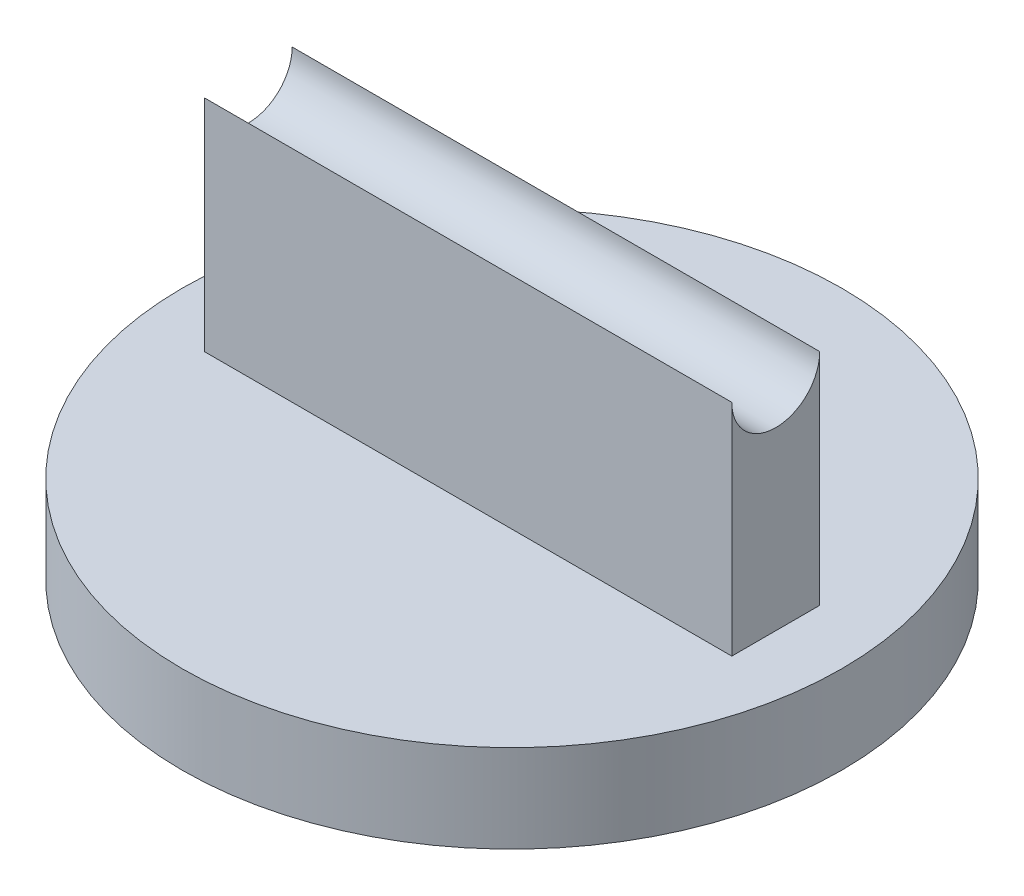
ISO-10303-21;
HEADER;
FILE_DESCRIPTION(('STEP AP214'),'2;1');
FILE_NAME('part.step','',(''),(''),'','','');
FILE_SCHEMA(('AUTOMOTIVE_DESIGN { 1 0 10303 214 1 1 1 1 }'));
ENDSEC;
DATA;
#1=APPLICATION_CONTEXT('core data for automotive mechanical design processes');
#2=APPLICATION_PROTOCOL_DEFINITION('international standard','automotive_design',2000,#1);
#3=PRODUCT_CONTEXT('',#1,'mechanical');
#4=PRODUCT('Part','Part','',(#3));
#5=PRODUCT_RELATED_PRODUCT_CATEGORY('part','',(#4));
#6=PRODUCT_DEFINITION_FORMATION('','',#4);
#7=PRODUCT_DEFINITION_CONTEXT('part definition',#1,'design');
#8=PRODUCT_DEFINITION('design','',#6,#7);
#9=PRODUCT_DEFINITION_SHAPE('','',#8);
#10=(LENGTH_UNIT() NAMED_UNIT(*) SI_UNIT(.MILLI.,.METRE.));
#11=(NAMED_UNIT(*) PLANE_ANGLE_UNIT() SI_UNIT($,.RADIAN.));
#12=(NAMED_UNIT(*) SI_UNIT($,.STERADIAN.) SOLID_ANGLE_UNIT());
#13=UNCERTAINTY_MEASURE_WITH_UNIT(LENGTH_MEASURE(1.E-05),#10,'distance_accuracy_value','');
#14=(GEOMETRIC_REPRESENTATION_CONTEXT(3) GLOBAL_UNCERTAINTY_ASSIGNED_CONTEXT((#13)) GLOBAL_UNIT_ASSIGNED_CONTEXT((#10,
#11,#12)) REPRESENTATION_CONTEXT('',''));
#15=CARTESIAN_POINT('',(0.,0.,0.));
#16=DIRECTION('',(0.,0.,1.));
#17=DIRECTION('',(1.,0.,0.));
#18=AXIS2_PLACEMENT_3D('',#15,#16,#17);
#19=CARTESIAN_POINT('',(0.,20.,0.));
#20=DIRECTION('',(0.,-1.,0.));
#21=DIRECTION('',(0.,0.,-1.));
#22=AXIS2_PLACEMENT_3D('',#19,#20,#21);
#23=CYLINDRICAL_SURFACE('',#22,75.);
#24=CARTESIAN_POINT('',(0.,20.,0.));
#25=DIRECTION('',(0.,1.,0.));
#26=DIRECTION('',(0.,0.,1.));
#27=AXIS2_PLACEMENT_3D('',#24,#25,#26);
#28=CIRCLE('',#27,75.);
#29=CARTESIAN_POINT('',(0.,20.,75.));
#30=VERTEX_POINT('',#29);
#31=EDGE_CURVE('E11',#30,#30,#28,.T.);
#32=ORIENTED_EDGE('',*,*,#31,.F.);
#33=EDGE_LOOP('',(#32));
#34=FACE_BOUND('',#33,.T.);
#35=CARTESIAN_POINT('',(0.,0.,0.));
#36=DIRECTION('',(0.,1.,0.));
#37=DIRECTION('',(0.,0.,1.));
#38=AXIS2_PLACEMENT_3D('',#35,#36,#37);
#39=CIRCLE('',#38,75.);
#40=CARTESIAN_POINT('',(0.,0.,75.));
#41=VERTEX_POINT('',#40);
#42=EDGE_CURVE('E42',#41,#41,#39,.T.);
#43=ORIENTED_EDGE('',*,*,#42,.T.);
#44=EDGE_LOOP('',(#43));
#45=FACE_BOUND('',#44,.T.);
#46=ADVANCED_FACE('F39',(#34,#45),#23,.T.);
#47=CARTESIAN_POINT('',(0.,20.,0.));
#48=DIRECTION('',(0.,1.,0.));
#49=DIRECTION('',(0.,0.,1.));
#50=AXIS2_PLACEMENT_3D('',#47,#48,#49);
#51=PLANE('',#50);
#52=DIRECTION('',(0.,0.,-1.));
#53=VECTOR('',#52,1.);
#54=CARTESIAN_POINT('',(60.,20.,-10.));
#55=LINE('',#54,#53);
#56=CARTESIAN_POINT('',(60.,20.,10.));
#57=VERTEX_POINT('',#56);
#58=CARTESIAN_POINT('',(60.,20.,-10.));
#59=VERTEX_POINT('',#58);
#60=EDGE_CURVE('E54',#57,#59,#55,.T.);
#61=ORIENTED_EDGE('',*,*,#60,.F.);
#62=DIRECTION('',(1.,0.,0.));
#63=VECTOR('',#62,1.);
#64=CARTESIAN_POINT('',(-60.,20.,10.));
#65=LINE('',#64,#63);
#66=CARTESIAN_POINT('',(-60.,20.,10.));
#67=VERTEX_POINT('',#66);
#68=EDGE_CURVE('E58',#67,#57,#65,.T.);
#69=ORIENTED_EDGE('',*,*,#68,.F.);
#70=DIRECTION('',(0.,0.,1.));
#71=VECTOR('',#70,1.);
#72=CARTESIAN_POINT('',(-60.,20.,-10.));
#73=LINE('',#72,#71);
#74=CARTESIAN_POINT('',(-60.,20.,-10.));
#75=VERTEX_POINT('',#74);
#76=EDGE_CURVE('E117',#75,#67,#73,.T.);
#77=ORIENTED_EDGE('',*,*,#76,.F.);
#78=DIRECTION('',(-1.,0.,0.));
#79=VECTOR('',#78,1.);
#80=CARTESIAN_POINT('',(-60.,20.,-10.));
#81=LINE('',#80,#79);
#82=EDGE_CURVE('E102',#59,#75,#81,.T.);
#83=ORIENTED_EDGE('',*,*,#82,.F.);
#84=EDGE_LOOP('',(#61,#69,#77,#83));
#85=FACE_BOUND('',#84,.T.);
#86=ORIENTED_EDGE('',*,*,#31,.T.);
#87=EDGE_LOOP('',(#86));
#88=FACE_BOUND('',#87,.T.);
#89=ADVANCED_FACE('F141',(#85,#88),#51,.T.);
#90=CARTESIAN_POINT('',(0.,0.,0.));
#91=DIRECTION('',(0.,1.,0.));
#92=DIRECTION('',(0.,0.,1.));
#93=AXIS2_PLACEMENT_3D('',#90,#91,#92);
#94=PLANE('',#93);
#95=ORIENTED_EDGE('',*,*,#42,.F.);
#96=EDGE_LOOP('',(#95));
#97=FACE_BOUND('',#96,.T.);
#98=ADVANCED_FACE('F146',(#97),#94,.F.);
#99=CARTESIAN_POINT('',(60.,70.,-10.));
#100=DIRECTION('',(-1.,0.,0.));
#101=DIRECTION('',(0.,0.,1.));
#102=AXIS2_PLACEMENT_3D('',#99,#100,#101);
#103=PLANE('',#102);
#104=DIRECTION('',(0.,-1.,0.));
#105=VECTOR('',#104,1.);
#106=CARTESIAN_POINT('',(60.,70.,-10.));
#107=LINE('',#106,#105);
#108=CARTESIAN_POINT('',(60.,70.,-10.));
#109=VERTEX_POINT('',#108);
#110=EDGE_CURVE('E104',#109,#59,#107,.T.);
#111=ORIENTED_EDGE('',*,*,#110,.F.);
#112=CARTESIAN_POINT('',(60.,70.,0.));
#113=DIRECTION('',(-1.,0.,0.));
#114=DIRECTION('',(0.,0.,1.));
#115=AXIS2_PLACEMENT_3D('',#112,#113,#114);
#116=CIRCLE('',#115,10.);
#117=CARTESIAN_POINT('',(60.,70.,9.99999999999996));
#118=VERTEX_POINT('',#117);
#119=EDGE_CURVE('E83',#109,#118,#116,.T.);
#120=ORIENTED_EDGE('',*,*,#119,.T.);
#121=DIRECTION('',(0.,-1.,0.));
#122=VECTOR('',#121,1.);
#123=CARTESIAN_POINT('',(60.,70.,10.));
#124=LINE('',#123,#122);
#125=EDGE_CURVE('E109',#118,#57,#124,.T.);
#126=ORIENTED_EDGE('',*,*,#125,.T.);
#127=ORIENTED_EDGE('',*,*,#60,.T.);
#128=EDGE_LOOP('',(#111,#120,#126,#127));
#129=FACE_BOUND('',#128,.T.);
#130=ADVANCED_FACE('F129',(#129),#103,.F.);
#131=CARTESIAN_POINT('',(-60.,70.,-10.));
#132=DIRECTION('',(0.,0.,1.));
#133=DIRECTION('',(1.,0.,0.));
#134=AXIS2_PLACEMENT_3D('',#131,#132,#133);
#135=PLANE('',#134);
#136=ORIENTED_EDGE('',*,*,#82,.T.);
#137=DIRECTION('',(0.,-1.,0.));
#138=VECTOR('',#137,1.);
#139=CARTESIAN_POINT('',(-60.,70.,-10.));
#140=LINE('',#139,#138);
#141=CARTESIAN_POINT('',(-60.,70.,-10.));
#142=VERTEX_POINT('',#141);
#143=EDGE_CURVE('E94',#142,#75,#140,.T.);
#144=ORIENTED_EDGE('',*,*,#143,.F.);
#145=DIRECTION('',(-1.,0.,0.));
#146=VECTOR('',#145,1.);
#147=CARTESIAN_POINT('',(-60.,70.,-10.));
#148=LINE('',#147,#146);
#149=EDGE_CURVE('E77',#109,#142,#148,.T.);
#150=ORIENTED_EDGE('',*,*,#149,.F.);
#151=ORIENTED_EDGE('',*,*,#110,.T.);
#152=EDGE_LOOP('',(#136,#144,#150,#151));
#153=FACE_BOUND('',#152,.T.);
#154=ADVANCED_FACE('F101',(#153),#135,.F.);
#155=CARTESIAN_POINT('',(-60.,70.,-10.));
#156=DIRECTION('',(1.,0.,0.));
#157=DIRECTION('',(0.,0.,-1.));
#158=AXIS2_PLACEMENT_3D('',#155,#156,#157);
#159=PLANE('',#158);
#160=DIRECTION('',(0.,-1.,0.));
#161=VECTOR('',#160,1.);
#162=CARTESIAN_POINT('',(-60.,70.,10.));
#163=LINE('',#162,#161);
#164=CARTESIAN_POINT('',(-60.,70.,10.));
#165=VERTEX_POINT('',#164);
#166=EDGE_CURVE('E96',#165,#67,#163,.T.);
#167=ORIENTED_EDGE('',*,*,#166,.F.);
#168=CARTESIAN_POINT('',(-60.,70.,0.));
#169=DIRECTION('',(-1.,0.,0.));
#170=DIRECTION('',(0.,0.,1.));
#171=AXIS2_PLACEMENT_3D('',#168,#169,#170);
#172=CIRCLE('',#171,10.);
#173=EDGE_CURVE('E80',#142,#165,#172,.T.);
#174=ORIENTED_EDGE('',*,*,#173,.F.);
#175=ORIENTED_EDGE('',*,*,#143,.T.);
#176=ORIENTED_EDGE('',*,*,#76,.T.);
#177=EDGE_LOOP('',(#167,#174,#175,#176));
#178=FACE_BOUND('',#177,.T.);
#179=ADVANCED_FACE('F93',(#178),#159,.F.);
#180=CARTESIAN_POINT('',(-60.,70.,10.));
#181=DIRECTION('',(0.,0.,-1.));
#182=DIRECTION('',(-1.,0.,0.));
#183=AXIS2_PLACEMENT_3D('',#180,#181,#182);
#184=PLANE('',#183);
#185=ORIENTED_EDGE('',*,*,#68,.T.);
#186=ORIENTED_EDGE('',*,*,#125,.F.);
#187=DIRECTION('',(1.,0.,0.));
#188=VECTOR('',#187,1.);
#189=CARTESIAN_POINT('',(-60.,70.,10.));
#190=LINE('',#189,#188);
#191=EDGE_CURVE('E89',#165,#118,#190,.T.);
#192=ORIENTED_EDGE('',*,*,#191,.F.);
#193=ORIENTED_EDGE('',*,*,#166,.T.);
#194=EDGE_LOOP('',(#185,#186,#192,#193));
#195=FACE_BOUND('',#194,.T.);
#196=ADVANCED_FACE('F131',(#195),#184,.F.);
#197=CARTESIAN_POINT('',(62.0000000000001,70.,0.));
#198=DIRECTION('',(-1.,0.,0.));
#199=DIRECTION('',(0.,0.,1.));
#200=AXIS2_PLACEMENT_3D('',#197,#198,#199);
#201=CYLINDRICAL_SURFACE('',#200,10.);
#202=ORIENTED_EDGE('',*,*,#149,.T.);
#203=ORIENTED_EDGE('',*,*,#173,.T.);
#204=ORIENTED_EDGE('',*,*,#191,.T.);
#205=ORIENTED_EDGE('',*,*,#119,.F.);
#206=EDGE_LOOP('',(#202,#203,#204,#205));
#207=FACE_BOUND('',#206,.T.);
#208=ADVANCED_FACE('F79',(#207),#201,.F.);
#209=CLOSED_SHELL('',(#46,#89,#98,#130,#154,#179,#196,#208));
#210=MANIFOLD_SOLID_BREP('B2',#209);
#211=ADVANCED_BREP_SHAPE_REPRESENTATION('',(#18,#210),#14);
#212=SHAPE_DEFINITION_REPRESENTATION(#9,#211);
ENDSEC;
END-ISO-10303-21;
